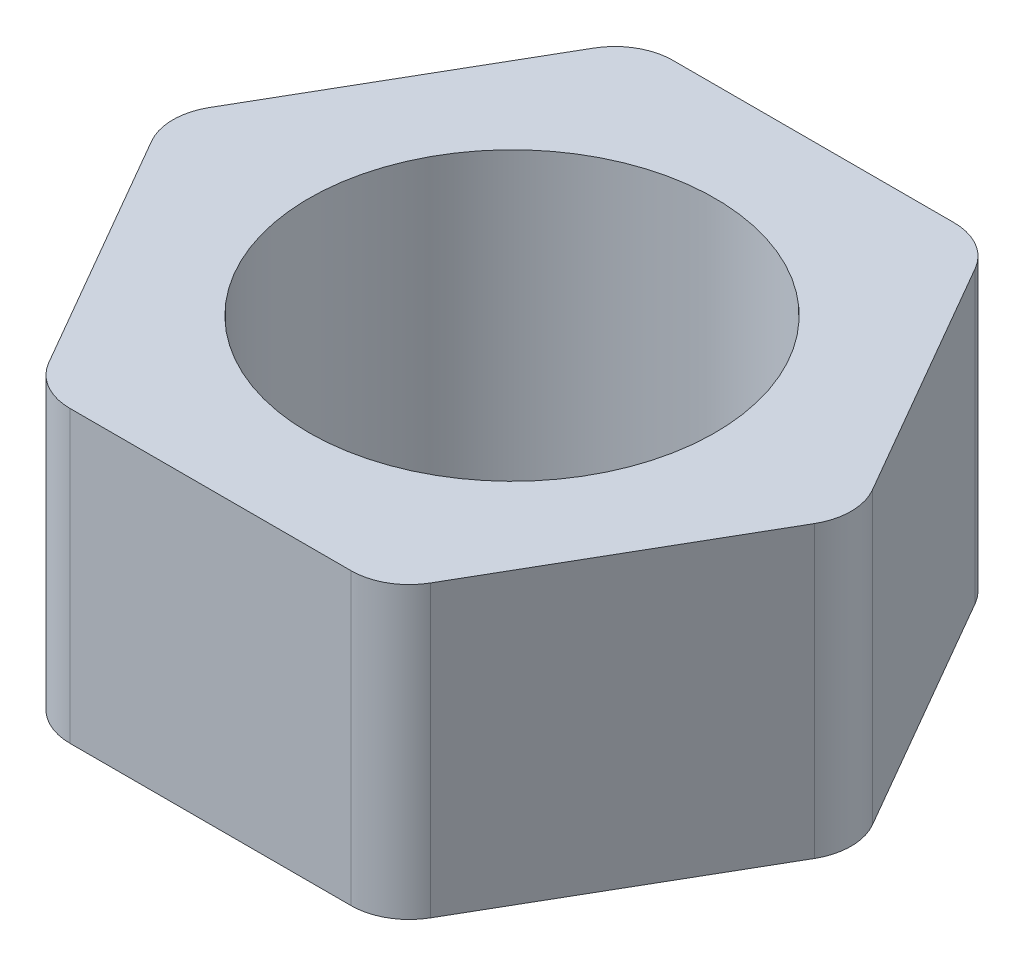
ISO-10303-21;
HEADER;
FILE_DESCRIPTION(('STEP AP214'),'2;1');
FILE_NAME('part.step','',(''),(''),'','','');
FILE_SCHEMA(('AUTOMOTIVE_DESIGN { 1 0 10303 214 1 1 1 1 }'));
ENDSEC;
DATA;
#1=APPLICATION_CONTEXT('core data for automotive mechanical design processes');
#2=APPLICATION_PROTOCOL_DEFINITION('international standard','automotive_design',2000,#1);
#3=PRODUCT_CONTEXT('',#1,'mechanical');
#4=PRODUCT('Part','Part','',(#3));
#5=PRODUCT_RELATED_PRODUCT_CATEGORY('part','',(#4));
#6=PRODUCT_DEFINITION_FORMATION('','',#4);
#7=PRODUCT_DEFINITION_CONTEXT('part definition',#1,'design');
#8=PRODUCT_DEFINITION('design','',#6,#7);
#9=PRODUCT_DEFINITION_SHAPE('','',#8);
#10=(LENGTH_UNIT() NAMED_UNIT(*) SI_UNIT(.MILLI.,.METRE.));
#11=(NAMED_UNIT(*) PLANE_ANGLE_UNIT() SI_UNIT($,.RADIAN.));
#12=(NAMED_UNIT(*) SI_UNIT($,.STERADIAN.) SOLID_ANGLE_UNIT());
#13=UNCERTAINTY_MEASURE_WITH_UNIT(LENGTH_MEASURE(1.E-05),#10,'distance_accuracy_value','');
#14=(GEOMETRIC_REPRESENTATION_CONTEXT(3) GLOBAL_UNCERTAINTY_ASSIGNED_CONTEXT((#13)) GLOBAL_UNIT_ASSIGNED_CONTEXT((#10,
#11,#12)) REPRESENTATION_CONTEXT('',''));
#15=CARTESIAN_POINT('',(0.,0.,0.));
#16=DIRECTION('',(0.,0.,1.));
#17=DIRECTION('',(1.,0.,0.));
#18=AXIS2_PLACEMENT_3D('',#15,#16,#17);
#19=CARTESIAN_POINT('',(0.,2.5,0.));
#20=DIRECTION('',(0.,1.,0.));
#21=DIRECTION('',(0.,0.,1.));
#22=AXIS2_PLACEMENT_3D('',#19,#20,#21);
#23=PLANE('',#22);
#24=DIRECTION('',(-0.500000000000001,0.,-0.866025403784438));
#25=VECTOR('',#24,1.);
#26=CARTESIAN_POINT('',(3.,2.5,0.));
#27=LINE('',#26,#25);
#28=CARTESIAN_POINT('',(2.8556624327026,2.5,-0.25));
#29=VERTEX_POINT('',#28);
#30=CARTESIAN_POINT('',(1.64433756729741,2.5,-2.34807621135332));
#31=VERTEX_POINT('',#30);
#32=EDGE_CURVE('E161',#29,#31,#27,.T.);
#33=ORIENTED_EDGE('',*,*,#32,.T.);
#34=CARTESIAN_POINT('',(1.21132486540519,2.5,-2.09807621135331));
#35=DIRECTION('',(0.,1.,0.));
#36=DIRECTION('',(0.,0.,1.));
#37=AXIS2_PLACEMENT_3D('',#34,#35,#36);
#38=CIRCLE('',#37,0.5);
#39=CARTESIAN_POINT('',(1.21132486540519,2.5,-2.59807621135331));
#40=VERTEX_POINT('',#39);
#41=EDGE_CURVE('E194',#31,#40,#38,.T.);
#42=ORIENTED_EDGE('',*,*,#41,.T.);
#43=DIRECTION('',(-1.,0.,0.));
#44=VECTOR('',#43,1.);
#45=CARTESIAN_POINT('',(1.5,2.5,-2.59807621135331));
#46=LINE('',#45,#44);
#47=CARTESIAN_POINT('',(-1.21132486540519,2.5,-2.59807621135331));
#48=VERTEX_POINT('',#47);
#49=EDGE_CURVE('E144',#40,#48,#46,.T.);
#50=ORIENTED_EDGE('',*,*,#49,.T.);
#51=CARTESIAN_POINT('',(-1.21132486540519,2.5,-2.09807621135331));
#52=DIRECTION('',(0.,1.,0.));
#53=DIRECTION('',(0.,0.,1.));
#54=AXIS2_PLACEMENT_3D('',#51,#52,#53);
#55=CIRCLE('',#54,0.5);
#56=CARTESIAN_POINT('',(-1.64433756729741,2.5,-2.34807621135331));
#57=VERTEX_POINT('',#56);
#58=EDGE_CURVE('E192',#48,#57,#55,.T.);
#59=ORIENTED_EDGE('',*,*,#58,.T.);
#60=DIRECTION('',(-0.499999999999999,0.,0.866025403784439));
#61=VECTOR('',#60,1.);
#62=CARTESIAN_POINT('',(-1.5,2.5,-2.59807621135331));
#63=LINE('',#62,#61);
#64=CARTESIAN_POINT('',(-2.85566243270259,2.5,-0.25));
#65=VERTEX_POINT('',#64);
#66=EDGE_CURVE('E231',#57,#65,#63,.T.);
#67=ORIENTED_EDGE('',*,*,#66,.T.);
#68=CARTESIAN_POINT('',(-2.42264973081037,2.5,0.));
#69=DIRECTION('',(0.,1.,0.));
#70=DIRECTION('',(0.,0.,1.));
#71=AXIS2_PLACEMENT_3D('',#68,#69,#70);
#72=CIRCLE('',#71,0.5);
#73=CARTESIAN_POINT('',(-2.85566243270259,2.5,0.25));
#74=VERTEX_POINT('',#73);
#75=EDGE_CURVE('E190',#65,#74,#72,.T.);
#76=ORIENTED_EDGE('',*,*,#75,.T.);
#77=DIRECTION('',(0.5,0.,0.866025403784439));
#78=VECTOR('',#77,1.);
#79=CARTESIAN_POINT('',(-3.,2.5,0.));
#80=LINE('',#79,#78);
#81=CARTESIAN_POINT('',(-1.6443375672974,2.5,2.34807621135332));
#82=VERTEX_POINT('',#81);
#83=EDGE_CURVE('E226',#74,#82,#80,.T.);
#84=ORIENTED_EDGE('',*,*,#83,.T.);
#85=CARTESIAN_POINT('',(-1.21132486540518,2.5,2.09807621135332));
#86=DIRECTION('',(0.,1.,0.));
#87=DIRECTION('',(0.,0.,1.));
#88=AXIS2_PLACEMENT_3D('',#85,#86,#87);
#89=CIRCLE('',#88,0.5);
#90=CARTESIAN_POINT('',(-1.21132486540518,2.5,2.59807621135332));
#91=VERTEX_POINT('',#90);
#92=EDGE_CURVE('E188',#82,#91,#89,.T.);
#93=ORIENTED_EDGE('',*,*,#92,.T.);
#94=DIRECTION('',(1.,0.,0.));
#95=VECTOR('',#94,1.);
#96=CARTESIAN_POINT('',(-1.49999999999999,2.5,2.59807621135332));
#97=LINE('',#96,#95);
#98=CARTESIAN_POINT('',(1.21132486540519,2.5,2.59807621135332));
#99=VERTEX_POINT('',#98);
#100=EDGE_CURVE('E225',#91,#99,#97,.T.);
#101=ORIENTED_EDGE('',*,*,#100,.T.);
#102=CARTESIAN_POINT('',(1.21132486540519,2.5,2.09807621135332));
#103=DIRECTION('',(0.,1.,0.));
#104=DIRECTION('',(0.,0.,1.));
#105=AXIS2_PLACEMENT_3D('',#102,#103,#104);
#106=CIRCLE('',#105,0.5);
#107=CARTESIAN_POINT('',(1.64433756729741,2.5,2.34807621135332));
#108=VERTEX_POINT('',#107);
#109=EDGE_CURVE('E55',#99,#108,#106,.T.);
#110=ORIENTED_EDGE('',*,*,#109,.T.);
#111=DIRECTION('',(0.499999999999999,0.,-0.866025403784439));
#112=VECTOR('',#111,1.);
#113=CARTESIAN_POINT('',(1.5,2.5,2.59807621135332));
#114=LINE('',#113,#112);
#115=CARTESIAN_POINT('',(2.8556624327026,2.5,0.250000000000001));
#116=VERTEX_POINT('',#115);
#117=EDGE_CURVE('E214',#108,#116,#114,.T.);
#118=ORIENTED_EDGE('',*,*,#117,.T.);
#119=CARTESIAN_POINT('',(2.42264973081038,2.5,0.));
#120=DIRECTION('',(0.,1.,0.));
#121=DIRECTION('',(0.,0.,1.));
#122=AXIS2_PLACEMENT_3D('',#119,#120,#121);
#123=CIRCLE('',#122,0.5);
#124=EDGE_CURVE('E186',#116,#29,#123,.T.);
#125=ORIENTED_EDGE('',*,*,#124,.T.);
#126=EDGE_LOOP('',(#33,#42,#50,#59,#67,#76,#84,#93,#101,#110,#118,#125));
#127=FACE_BOUND('',#126,.T.);
#128=CARTESIAN_POINT('',(0.,2.5,0.));
#129=DIRECTION('',(0.,1.,0.));
#130=DIRECTION('',(0.,0.,1.));
#131=AXIS2_PLACEMENT_3D('',#128,#129,#130);
#132=CIRCLE('',#131,1.75);
#133=CARTESIAN_POINT('',(0.,2.5,1.75));
#134=VERTEX_POINT('',#133);
#135=EDGE_CURVE('E152',#134,#134,#132,.T.);
#136=ORIENTED_EDGE('',*,*,#135,.F.);
#137=EDGE_LOOP('',(#136));
#138=FACE_BOUND('',#137,.T.);
#139=ADVANCED_FACE('F35',(#127,#138),#23,.T.);
#140=CARTESIAN_POINT('',(0.,0.,0.));
#141=DIRECTION('',(0.,1.,0.));
#142=DIRECTION('',(0.,0.,1.));
#143=AXIS2_PLACEMENT_3D('',#140,#141,#142);
#144=PLANE('',#143);
#145=DIRECTION('',(-1.,0.,0.));
#146=VECTOR('',#145,1.);
#147=CARTESIAN_POINT('',(1.5,0.,-2.59807621135331));
#148=LINE('',#147,#146);
#149=CARTESIAN_POINT('',(1.21132486540519,0.,-2.59807621135331));
#150=VERTEX_POINT('',#149);
#151=CARTESIAN_POINT('',(-1.21132486540519,0.,-2.59807621135331));
#152=VERTEX_POINT('',#151);
#153=EDGE_CURVE('E141',#150,#152,#148,.T.);
#154=ORIENTED_EDGE('',*,*,#153,.F.);
#155=CARTESIAN_POINT('',(1.21132486540519,0.,-2.09807621135331));
#156=DIRECTION('',(0.,1.,0.));
#157=DIRECTION('',(0.,0.,1.));
#158=AXIS2_PLACEMENT_3D('',#155,#156,#157);
#159=CIRCLE('',#158,0.5);
#160=CARTESIAN_POINT('',(1.64433756729741,0.,-2.34807621135332));
#161=VERTEX_POINT('',#160);
#162=EDGE_CURVE('E124',#150,#161,#159,.F.);
#163=ORIENTED_EDGE('',*,*,#162,.T.);
#164=DIRECTION('',(-0.500000000000001,0.,-0.866025403784438));
#165=VECTOR('',#164,1.);
#166=CARTESIAN_POINT('',(3.,0.,0.));
#167=LINE('',#166,#165);
#168=CARTESIAN_POINT('',(2.8556624327026,0.,-0.25));
#169=VERTEX_POINT('',#168);
#170=EDGE_CURVE('E171',#169,#161,#167,.T.);
#171=ORIENTED_EDGE('',*,*,#170,.F.);
#172=CARTESIAN_POINT('',(2.42264973081038,0.,0.));
#173=DIRECTION('',(0.,1.,0.));
#174=DIRECTION('',(0.,0.,1.));
#175=AXIS2_PLACEMENT_3D('',#172,#173,#174);
#176=CIRCLE('',#175,0.5);
#177=CARTESIAN_POINT('',(2.8556624327026,0.,0.250000000000001));
#178=VERTEX_POINT('',#177);
#179=EDGE_CURVE('E175',#169,#178,#176,.F.);
#180=ORIENTED_EDGE('',*,*,#179,.T.);
#181=DIRECTION('',(0.499999999999999,0.,-0.866025403784439));
#182=VECTOR('',#181,1.);
#183=CARTESIAN_POINT('',(1.5,0.,2.59807621135332));
#184=LINE('',#183,#182);
#185=CARTESIAN_POINT('',(1.64433756729741,0.,2.34807621135332));
#186=VERTEX_POINT('',#185);
#187=EDGE_CURVE('E169',#186,#178,#184,.T.);
#188=ORIENTED_EDGE('',*,*,#187,.F.);
#189=CARTESIAN_POINT('',(1.21132486540519,0.,2.09807621135332));
#190=DIRECTION('',(0.,1.,0.));
#191=DIRECTION('',(0.,0.,1.));
#192=AXIS2_PLACEMENT_3D('',#189,#190,#191);
#193=CIRCLE('',#192,0.5);
#194=CARTESIAN_POINT('',(1.21132486540519,0.,2.59807621135332));
#195=VERTEX_POINT('',#194);
#196=EDGE_CURVE('E145',#186,#195,#193,.F.);
#197=ORIENTED_EDGE('',*,*,#196,.T.);
#198=DIRECTION('',(1.,0.,0.));
#199=VECTOR('',#198,1.);
#200=CARTESIAN_POINT('',(-1.49999999999999,0.,2.59807621135332));
#201=LINE('',#200,#199);
#202=CARTESIAN_POINT('',(-1.21132486540518,0.,2.59807621135332));
#203=VERTEX_POINT('',#202);
#204=EDGE_CURVE('E166',#203,#195,#201,.T.);
#205=ORIENTED_EDGE('',*,*,#204,.F.);
#206=CARTESIAN_POINT('',(-1.21132486540518,0.,2.09807621135332));
#207=DIRECTION('',(0.,1.,0.));
#208=DIRECTION('',(0.,0.,1.));
#209=AXIS2_PLACEMENT_3D('',#206,#207,#208);
#210=CIRCLE('',#209,0.5);
#211=CARTESIAN_POINT('',(-1.6443375672974,0.,2.34807621135332));
#212=VERTEX_POINT('',#211);
#213=EDGE_CURVE('E177',#203,#212,#210,.F.);
#214=ORIENTED_EDGE('',*,*,#213,.T.);
#215=DIRECTION('',(0.5,0.,0.866025403784439));
#216=VECTOR('',#215,1.);
#217=CARTESIAN_POINT('',(-3.,0.,0.));
#218=LINE('',#217,#216);
#219=CARTESIAN_POINT('',(-2.85566243270259,0.,0.25));
#220=VERTEX_POINT('',#219);
#221=EDGE_CURVE('E155',#220,#212,#218,.T.);
#222=ORIENTED_EDGE('',*,*,#221,.F.);
#223=CARTESIAN_POINT('',(-2.42264973081037,0.,0.));
#224=DIRECTION('',(0.,1.,0.));
#225=DIRECTION('',(0.,0.,1.));
#226=AXIS2_PLACEMENT_3D('',#223,#224,#225);
#227=CIRCLE('',#226,0.5);
#228=CARTESIAN_POINT('',(-2.85566243270259,0.,-0.25));
#229=VERTEX_POINT('',#228);
#230=EDGE_CURVE('E179',#220,#229,#227,.F.);
#231=ORIENTED_EDGE('',*,*,#230,.T.);
#232=DIRECTION('',(-0.499999999999999,0.,0.866025403784439));
#233=VECTOR('',#232,1.);
#234=CARTESIAN_POINT('',(-1.5,0.,-2.59807621135331));
#235=LINE('',#234,#233);
#236=CARTESIAN_POINT('',(-1.64433756729741,0.,-2.34807621135331));
#237=VERTEX_POINT('',#236);
#238=EDGE_CURVE('E151',#237,#229,#235,.T.);
#239=ORIENTED_EDGE('',*,*,#238,.F.);
#240=CARTESIAN_POINT('',(-1.21132486540519,0.,-2.09807621135331));
#241=DIRECTION('',(0.,1.,0.));
#242=DIRECTION('',(0.,0.,1.));
#243=AXIS2_PLACEMENT_3D('',#240,#241,#242);
#244=CIRCLE('',#243,0.5);
#245=EDGE_CURVE('E135',#237,#152,#244,.F.);
#246=ORIENTED_EDGE('',*,*,#245,.T.);
#247=EDGE_LOOP('',(#154,#163,#171,#180,#188,#197,#205,#214,#222,#231,#239,#246));
#248=FACE_BOUND('',#247,.T.);
#249=CARTESIAN_POINT('',(0.,0.,0.));
#250=DIRECTION('',(0.,1.,0.));
#251=DIRECTION('',(0.,0.,1.));
#252=AXIS2_PLACEMENT_3D('',#249,#250,#251);
#253=CIRCLE('',#252,1.75);
#254=CARTESIAN_POINT('',(0.,0.,1.75));
#255=VERTEX_POINT('',#254);
#256=EDGE_CURVE('E158',#255,#255,#253,.T.);
#257=ORIENTED_EDGE('',*,*,#256,.T.);
#258=EDGE_LOOP('',(#257));
#259=FACE_BOUND('',#258,.T.);
#260=ADVANCED_FACE('F148',(#248,#259),#144,.F.);
#261=CARTESIAN_POINT('',(1.5,2.5,-2.59807621135331));
#262=DIRECTION('',(0.,0.,1.));
#263=DIRECTION('',(1.,0.,0.));
#264=AXIS2_PLACEMENT_3D('',#261,#262,#263);
#265=PLANE('',#264);
#266=ORIENTED_EDGE('',*,*,#49,.F.);
#267=DIRECTION('',(0.,-1.,0.));
#268=VECTOR('',#267,1.);
#269=CARTESIAN_POINT('',(1.21132486540519,2.5,-2.59807621135331));
#270=LINE('',#269,#268);
#271=EDGE_CURVE('E128',#40,#150,#270,.T.);
#272=ORIENTED_EDGE('',*,*,#271,.T.);
#273=ORIENTED_EDGE('',*,*,#153,.T.);
#274=DIRECTION('',(0.,-1.,0.));
#275=VECTOR('',#274,1.);
#276=CARTESIAN_POINT('',(-1.21132486540519,2.5,-2.59807621135331));
#277=LINE('',#276,#275);
#278=EDGE_CURVE('E146',#152,#48,#277,.F.);
#279=ORIENTED_EDGE('',*,*,#278,.T.);
#280=EDGE_LOOP('',(#266,#272,#273,#279));
#281=FACE_BOUND('',#280,.T.);
#282=ADVANCED_FACE('F140',(#281),#265,.F.);
#283=CARTESIAN_POINT('',(-1.5,2.5,-2.59807621135331));
#284=DIRECTION('',(0.866025403784439,0.,0.499999999999999));
#285=DIRECTION('',(0.499999999999999,0.,-0.866025403784439));
#286=AXIS2_PLACEMENT_3D('',#283,#284,#285);
#287=PLANE('',#286);
#288=ORIENTED_EDGE('',*,*,#66,.F.);
#289=DIRECTION('',(0.,-1.,0.));
#290=VECTOR('',#289,1.);
#291=CARTESIAN_POINT('',(-1.64433756729741,2.5,-2.34807621135331));
#292=LINE('',#291,#290);
#293=EDGE_CURVE('E198',#57,#237,#292,.T.);
#294=ORIENTED_EDGE('',*,*,#293,.T.);
#295=ORIENTED_EDGE('',*,*,#238,.T.);
#296=DIRECTION('',(0.,-1.,0.));
#297=VECTOR('',#296,1.);
#298=CARTESIAN_POINT('',(-2.85566243270259,2.5,-0.25));
#299=LINE('',#298,#297);
#300=EDGE_CURVE('E196',#229,#65,#299,.F.);
#301=ORIENTED_EDGE('',*,*,#300,.T.);
#302=EDGE_LOOP('',(#288,#294,#295,#301));
#303=FACE_BOUND('',#302,.T.);
#304=ADVANCED_FACE('F266',(#303),#287,.F.);
#305=CARTESIAN_POINT('',(-3.,2.5,0.));
#306=DIRECTION('',(0.866025403784439,0.,-0.5));
#307=DIRECTION('',(-0.5,0.,-0.866025403784439));
#308=AXIS2_PLACEMENT_3D('',#305,#306,#307);
#309=PLANE('',#308);
#310=ORIENTED_EDGE('',*,*,#83,.F.);
#311=DIRECTION('',(0.,-1.,0.));
#312=VECTOR('',#311,1.);
#313=CARTESIAN_POINT('',(-2.85566243270259,2.5,0.25));
#314=LINE('',#313,#312);
#315=EDGE_CURVE('E203',#74,#220,#314,.T.);
#316=ORIENTED_EDGE('',*,*,#315,.T.);
#317=ORIENTED_EDGE('',*,*,#221,.T.);
#318=DIRECTION('',(0.,-1.,0.));
#319=VECTOR('',#318,1.);
#320=CARTESIAN_POINT('',(-1.6443375672974,2.5,2.34807621135332));
#321=LINE('',#320,#319);
#322=EDGE_CURVE('E201',#212,#82,#321,.F.);
#323=ORIENTED_EDGE('',*,*,#322,.T.);
#324=EDGE_LOOP('',(#310,#316,#317,#323));
#325=FACE_BOUND('',#324,.T.);
#326=ADVANCED_FACE('F262',(#325),#309,.F.);
#327=CARTESIAN_POINT('',(-1.49999999999999,2.5,2.59807621135332));
#328=DIRECTION('',(0.,0.,-1.));
#329=DIRECTION('',(-1.,0.,0.));
#330=AXIS2_PLACEMENT_3D('',#327,#328,#329);
#331=PLANE('',#330);
#332=ORIENTED_EDGE('',*,*,#100,.F.);
#333=DIRECTION('',(0.,-1.,0.));
#334=VECTOR('',#333,1.);
#335=CARTESIAN_POINT('',(-1.21132486540518,2.5,2.59807621135332));
#336=LINE('',#335,#334);
#337=EDGE_CURVE('E208',#91,#203,#336,.T.);
#338=ORIENTED_EDGE('',*,*,#337,.T.);
#339=ORIENTED_EDGE('',*,*,#204,.T.);
#340=DIRECTION('',(0.,-1.,0.));
#341=VECTOR('',#340,1.);
#342=CARTESIAN_POINT('',(1.21132486540519,2.5,2.59807621135332));
#343=LINE('',#342,#341);
#344=EDGE_CURVE('E206',#195,#99,#343,.F.);
#345=ORIENTED_EDGE('',*,*,#344,.T.);
#346=EDGE_LOOP('',(#332,#338,#339,#345));
#347=FACE_BOUND('',#346,.T.);
#348=ADVANCED_FACE('F259',(#347),#331,.F.);
#349=CARTESIAN_POINT('',(1.5,2.5,2.59807621135332));
#350=DIRECTION('',(-0.866025403784439,0.,-0.499999999999999));
#351=DIRECTION('',(-0.499999999999999,0.,0.866025403784439));
#352=AXIS2_PLACEMENT_3D('',#349,#350,#351);
#353=PLANE('',#352);
#354=ORIENTED_EDGE('',*,*,#187,.T.);
#355=DIRECTION('',(0.,-1.,0.));
#356=VECTOR('',#355,1.);
#357=CARTESIAN_POINT('',(2.8556624327026,2.5,0.250000000000001));
#358=LINE('',#357,#356);
#359=EDGE_CURVE('E11',#178,#116,#358,.F.);
#360=ORIENTED_EDGE('',*,*,#359,.T.);
#361=ORIENTED_EDGE('',*,*,#117,.F.);
#362=DIRECTION('',(0.,-1.,0.));
#363=VECTOR('',#362,1.);
#364=CARTESIAN_POINT('',(1.64433756729741,2.5,2.34807621135332));
#365=LINE('',#364,#363);
#366=EDGE_CURVE('E43',#108,#186,#365,.T.);
#367=ORIENTED_EDGE('',*,*,#366,.T.);
#368=EDGE_LOOP('',(#354,#360,#361,#367));
#369=FACE_BOUND('',#368,.T.);
#370=ADVANCED_FACE('F213',(#369),#353,.F.);
#371=CARTESIAN_POINT('',(3.,2.5,0.));
#372=DIRECTION('',(-0.866025403784438,0.,0.500000000000001));
#373=DIRECTION('',(0.500000000000001,0.,0.866025403784438));
#374=AXIS2_PLACEMENT_3D('',#371,#372,#373);
#375=PLANE('',#374);
#376=ORIENTED_EDGE('',*,*,#170,.T.);
#377=DIRECTION('',(0.,-1.,0.));
#378=VECTOR('',#377,1.);
#379=CARTESIAN_POINT('',(1.64433756729741,2.5,-2.34807621135332));
#380=LINE('',#379,#378);
#381=EDGE_CURVE('E129',#161,#31,#380,.F.);
#382=ORIENTED_EDGE('',*,*,#381,.T.);
#383=ORIENTED_EDGE('',*,*,#32,.F.);
#384=DIRECTION('',(0.,-1.,0.));
#385=VECTOR('',#384,1.);
#386=CARTESIAN_POINT('',(2.8556624327026,2.5,-0.25));
#387=LINE('',#386,#385);
#388=EDGE_CURVE('E134',#29,#169,#387,.T.);
#389=ORIENTED_EDGE('',*,*,#388,.T.);
#390=EDGE_LOOP('',(#376,#382,#383,#389));
#391=FACE_BOUND('',#390,.T.);
#392=ADVANCED_FACE('F223',(#391),#375,.F.);
#393=CARTESIAN_POINT('',(0.,2.5,0.));
#394=DIRECTION('',(0.,-1.,0.));
#395=DIRECTION('',(0.,0.,-1.));
#396=AXIS2_PLACEMENT_3D('',#393,#394,#395);
#397=CYLINDRICAL_SURFACE('',#396,1.75);
#398=ORIENTED_EDGE('',*,*,#135,.T.);
#399=EDGE_LOOP('',(#398));
#400=FACE_BOUND('',#399,.T.);
#401=ORIENTED_EDGE('',*,*,#256,.F.);
#402=EDGE_LOOP('',(#401));
#403=FACE_BOUND('',#402,.T.);
#404=ADVANCED_FACE('F238',(#400,#403),#397,.F.);
#405=CARTESIAN_POINT('',(1.21132486540519,2.5,-2.09807621135331));
#406=DIRECTION('',(0.,-1.,0.));
#407=DIRECTION('',(0.,0.,-1.));
#408=AXIS2_PLACEMENT_3D('',#405,#406,#407);
#409=CYLINDRICAL_SURFACE('',#408,0.5);
#410=ORIENTED_EDGE('',*,*,#41,.F.);
#411=ORIENTED_EDGE('',*,*,#381,.F.);
#412=ORIENTED_EDGE('',*,*,#162,.F.);
#413=ORIENTED_EDGE('',*,*,#271,.F.);
#414=EDGE_LOOP('',(#410,#411,#412,#413));
#415=FACE_BOUND('',#414,.T.);
#416=ADVANCED_FACE('F127',(#415),#409,.T.);
#417=CARTESIAN_POINT('',(-1.21132486540519,2.5,-2.09807621135331));
#418=DIRECTION('',(0.,-1.,0.));
#419=DIRECTION('',(0.,0.,-1.));
#420=AXIS2_PLACEMENT_3D('',#417,#418,#419);
#421=CYLINDRICAL_SURFACE('',#420,0.5);
#422=ORIENTED_EDGE('',*,*,#58,.F.);
#423=ORIENTED_EDGE('',*,*,#278,.F.);
#424=ORIENTED_EDGE('',*,*,#245,.F.);
#425=ORIENTED_EDGE('',*,*,#293,.F.);
#426=EDGE_LOOP('',(#422,#423,#424,#425));
#427=FACE_BOUND('',#426,.T.);
#428=ADVANCED_FACE('F246',(#427),#421,.T.);
#429=CARTESIAN_POINT('',(-2.42264973081037,2.5,0.));
#430=DIRECTION('',(0.,-1.,0.));
#431=DIRECTION('',(0.,0.,-1.));
#432=AXIS2_PLACEMENT_3D('',#429,#430,#431);
#433=CYLINDRICAL_SURFACE('',#432,0.5);
#434=ORIENTED_EDGE('',*,*,#75,.F.);
#435=ORIENTED_EDGE('',*,*,#300,.F.);
#436=ORIENTED_EDGE('',*,*,#230,.F.);
#437=ORIENTED_EDGE('',*,*,#315,.F.);
#438=EDGE_LOOP('',(#434,#435,#436,#437));
#439=FACE_BOUND('',#438,.T.);
#440=ADVANCED_FACE('F275',(#439),#433,.T.);
#441=CARTESIAN_POINT('',(-1.21132486540518,2.5,2.09807621135332));
#442=DIRECTION('',(0.,-1.,0.));
#443=DIRECTION('',(0.,0.,-1.));
#444=AXIS2_PLACEMENT_3D('',#441,#442,#443);
#445=CYLINDRICAL_SURFACE('',#444,0.5);
#446=ORIENTED_EDGE('',*,*,#92,.F.);
#447=ORIENTED_EDGE('',*,*,#322,.F.);
#448=ORIENTED_EDGE('',*,*,#213,.F.);
#449=ORIENTED_EDGE('',*,*,#337,.F.);
#450=EDGE_LOOP('',(#446,#447,#448,#449));
#451=FACE_BOUND('',#450,.T.);
#452=ADVANCED_FACE('F279',(#451),#445,.T.);
#453=CARTESIAN_POINT('',(2.42264973081038,2.5,0.));
#454=DIRECTION('',(0.,-1.,0.));
#455=DIRECTION('',(0.,0.,-1.));
#456=AXIS2_PLACEMENT_3D('',#453,#454,#455);
#457=CYLINDRICAL_SURFACE('',#456,0.5);
#458=ORIENTED_EDGE('',*,*,#124,.F.);
#459=ORIENTED_EDGE('',*,*,#359,.F.);
#460=ORIENTED_EDGE('',*,*,#179,.F.);
#461=ORIENTED_EDGE('',*,*,#388,.F.);
#462=EDGE_LOOP('',(#458,#459,#460,#461));
#463=FACE_BOUND('',#462,.T.);
#464=ADVANCED_FACE('F220',(#463),#457,.T.);
#465=CARTESIAN_POINT('',(1.21132486540519,2.5,2.09807621135332));
#466=DIRECTION('',(0.,-1.,0.));
#467=DIRECTION('',(0.,0.,-1.));
#468=AXIS2_PLACEMENT_3D('',#465,#466,#467);
#469=CYLINDRICAL_SURFACE('',#468,0.5);
#470=ORIENTED_EDGE('',*,*,#109,.F.);
#471=ORIENTED_EDGE('',*,*,#344,.F.);
#472=ORIENTED_EDGE('',*,*,#196,.F.);
#473=ORIENTED_EDGE('',*,*,#366,.F.);
#474=EDGE_LOOP('',(#470,#471,#472,#473));
#475=FACE_BOUND('',#474,.T.);
#476=ADVANCED_FACE('F37',(#475),#469,.T.);
#477=CLOSED_SHELL('',(#139,#260,#282,#304,#326,#348,#370,#392,#404,#416,#428,#440,#452,#464,#476));
#478=MANIFOLD_SOLID_BREP('B2',#477);
#479=ADVANCED_BREP_SHAPE_REPRESENTATION('',(#18,#478),#14);
#480=SHAPE_DEFINITION_REPRESENTATION(#9,#479);
ENDSEC;
END-ISO-10303-21;
